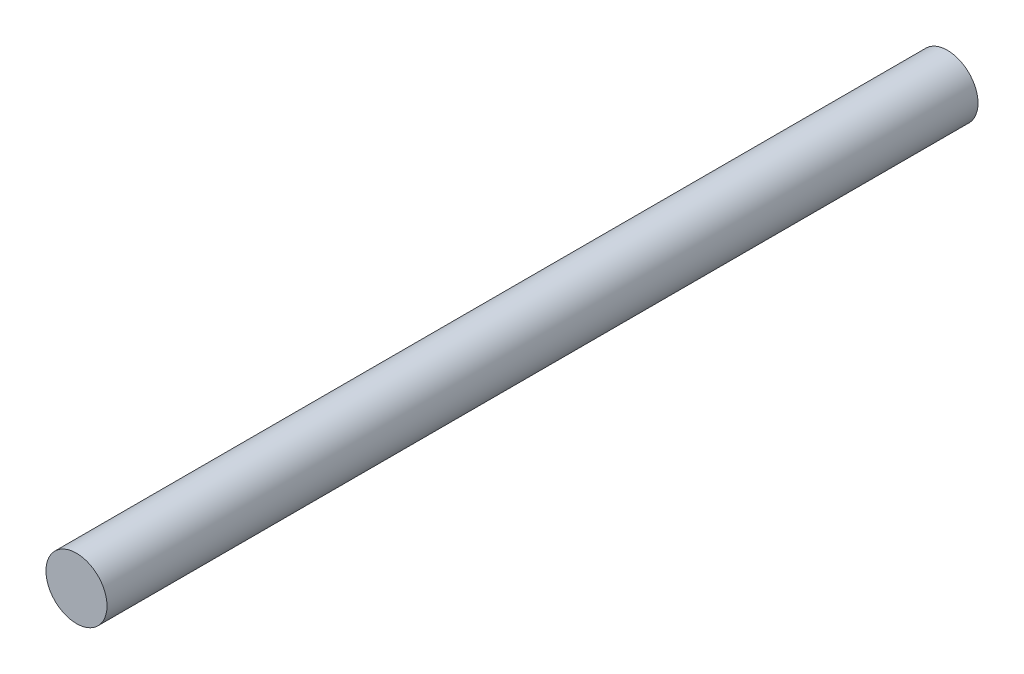
ISO-10303-21;
HEADER;
FILE_DESCRIPTION(('STEP AP214'),'2;1');
FILE_NAME('part.step','',(''),(''),'','','');
FILE_SCHEMA(('AUTOMOTIVE_DESIGN { 1 0 10303 214 1 1 1 1 }'));
ENDSEC;
DATA;
#1=APPLICATION_CONTEXT('core data for automotive mechanical design processes');
#2=APPLICATION_PROTOCOL_DEFINITION('international standard','automotive_design',2000,#1);
#3=PRODUCT_CONTEXT('',#1,'mechanical');
#4=PRODUCT('Part','Part','',(#3));
#5=PRODUCT_RELATED_PRODUCT_CATEGORY('part','',(#4));
#6=PRODUCT_DEFINITION_FORMATION('','',#4);
#7=PRODUCT_DEFINITION_CONTEXT('part definition',#1,'design');
#8=PRODUCT_DEFINITION('design','',#6,#7);
#9=PRODUCT_DEFINITION_SHAPE('','',#8);
#10=(LENGTH_UNIT() NAMED_UNIT(*) SI_UNIT(.MILLI.,.METRE.));
#11=(NAMED_UNIT(*) PLANE_ANGLE_UNIT() SI_UNIT($,.RADIAN.));
#12=(NAMED_UNIT(*) SI_UNIT($,.STERADIAN.) SOLID_ANGLE_UNIT());
#13=UNCERTAINTY_MEASURE_WITH_UNIT(LENGTH_MEASURE(1.E-05),#10,'distance_accuracy_value','');
#14=(GEOMETRIC_REPRESENTATION_CONTEXT(3) GLOBAL_UNCERTAINTY_ASSIGNED_CONTEXT((#13)) GLOBAL_UNIT_ASSIGNED_CONTEXT((#10,
#11,#12)) REPRESENTATION_CONTEXT('',''));
#15=CARTESIAN_POINT('',(0.,0.,0.));
#16=DIRECTION('',(0.,0.,1.));
#17=DIRECTION('',(1.,0.,0.));
#18=AXIS2_PLACEMENT_3D('',#15,#16,#17);
#19=CARTESIAN_POINT('',(0.,0.,-35.));
#20=DIRECTION('',(0.,0.,1.));
#21=DIRECTION('',(1.,0.,0.));
#22=AXIS2_PLACEMENT_3D('',#19,#20,#21);
#23=CYLINDRICAL_SURFACE('',#22,2.45);
#24=CARTESIAN_POINT('',(0.,0.,-34.95));
#25=DIRECTION('',(0.,0.,1.));
#26=DIRECTION('',(1.,0.,0.));
#27=AXIS2_PLACEMENT_3D('',#24,#25,#26);
#28=CIRCLE('',#27,2.45);
#29=CARTESIAN_POINT('',(2.45,0.,-34.95));
#30=VERTEX_POINT('',#29);
#31=EDGE_CURVE('E11',#30,#30,#28,.T.);
#32=ORIENTED_EDGE('',*,*,#31,.T.);
#33=EDGE_LOOP('',(#32));
#34=FACE_BOUND('',#33,.T.);
#35=CARTESIAN_POINT('',(0.,0.,34.95));
#36=DIRECTION('',(0.,0.,1.));
#37=DIRECTION('',(1.,0.,0.));
#38=AXIS2_PLACEMENT_3D('',#35,#36,#37);
#39=CIRCLE('',#38,2.45);
#40=CARTESIAN_POINT('',(2.45,0.,34.95));
#41=VERTEX_POINT('',#40);
#42=EDGE_CURVE('E42',#41,#41,#39,.T.);
#43=ORIENTED_EDGE('',*,*,#42,.F.);
#44=EDGE_LOOP('',(#43));
#45=FACE_BOUND('',#44,.T.);
#46=ADVANCED_FACE('F38',(#34,#45),#23,.T.);
#47=CARTESIAN_POINT('',(0.,0.,-34.95));
#48=DIRECTION('',(0.,0.,1.));
#49=DIRECTION('',(1.,0.,0.));
#50=AXIS2_PLACEMENT_3D('',#47,#48,#49);
#51=PLANE('',#50);
#52=ORIENTED_EDGE('',*,*,#31,.F.);
#53=EDGE_LOOP('',(#52));
#54=FACE_BOUND('',#53,.T.);
#55=ADVANCED_FACE('F55',(#54),#51,.F.);
#56=CARTESIAN_POINT('',(0.,0.,34.95));
#57=DIRECTION('',(0.,0.,1.));
#58=DIRECTION('',(1.,0.,0.));
#59=AXIS2_PLACEMENT_3D('',#56,#57,#58);
#60=PLANE('',#59);
#61=ORIENTED_EDGE('',*,*,#42,.T.);
#62=EDGE_LOOP('',(#61));
#63=FACE_BOUND('',#62,.T.);
#64=ADVANCED_FACE('F40',(#63),#60,.T.);
#65=CLOSED_SHELL('',(#46,#55,#64));
#66=MANIFOLD_SOLID_BREP('B2',#65);
#67=ADVANCED_BREP_SHAPE_REPRESENTATION('',(#18,#66),#14);
#68=SHAPE_DEFINITION_REPRESENTATION(#9,#67);
ENDSEC;
END-ISO-10303-21;
